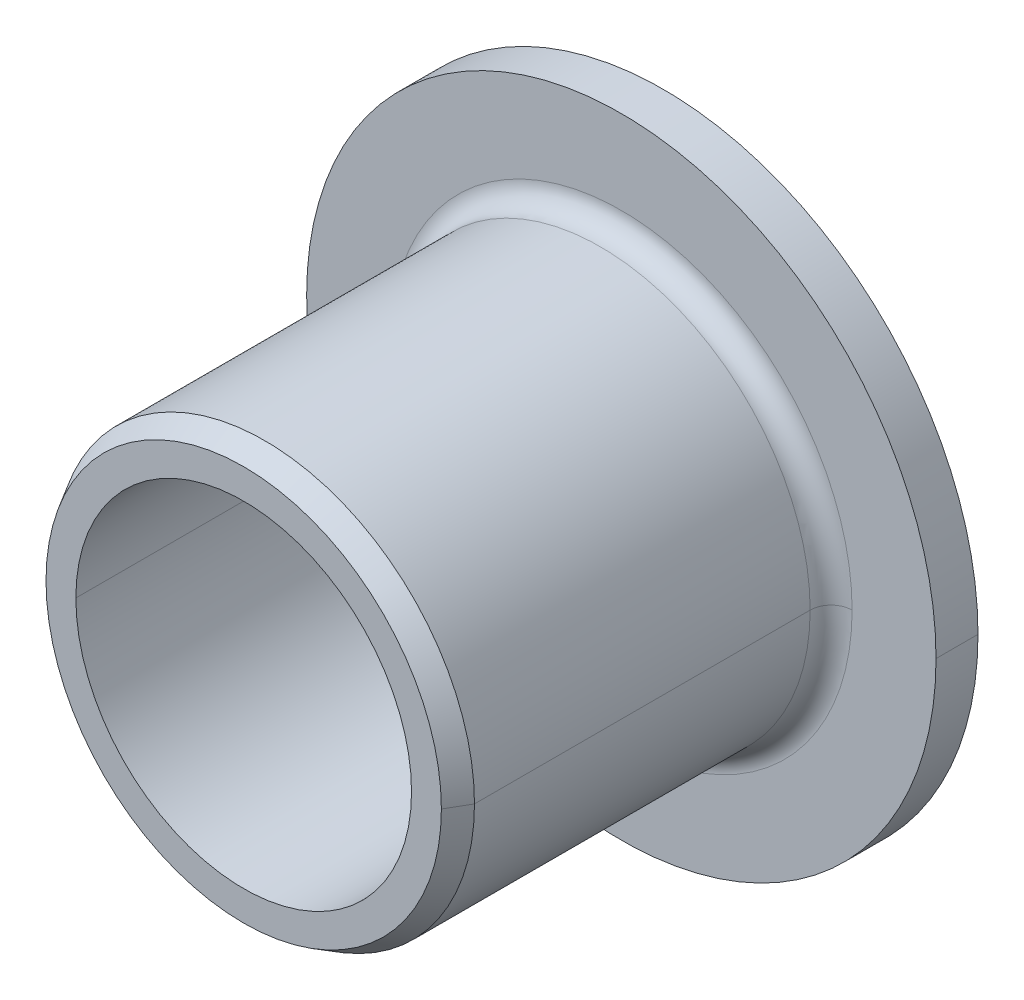
ISO-10303-21;
HEADER;
FILE_DESCRIPTION(('STEP AP214'),'2;1');
FILE_NAME('part.step','',(''),(''),'','','');
FILE_SCHEMA(('AUTOMOTIVE_DESIGN { 1 0 10303 214 1 1 1 1 }'));
ENDSEC;
DATA;
#1=APPLICATION_CONTEXT('core data for automotive mechanical design processes');
#2=APPLICATION_PROTOCOL_DEFINITION('international standard','automotive_design',2000,#1);
#3=PRODUCT_CONTEXT('',#1,'mechanical');
#4=PRODUCT('Part','Part','',(#3));
#5=PRODUCT_RELATED_PRODUCT_CATEGORY('part','',(#4));
#6=PRODUCT_DEFINITION_FORMATION('','',#4);
#7=PRODUCT_DEFINITION_CONTEXT('part definition',#1,'design');
#8=PRODUCT_DEFINITION('design','',#6,#7);
#9=PRODUCT_DEFINITION_SHAPE('','',#8);
#10=(LENGTH_UNIT() NAMED_UNIT(*) SI_UNIT(.MILLI.,.METRE.));
#11=(NAMED_UNIT(*) PLANE_ANGLE_UNIT() SI_UNIT($,.RADIAN.));
#12=(NAMED_UNIT(*) SI_UNIT($,.STERADIAN.) SOLID_ANGLE_UNIT());
#13=UNCERTAINTY_MEASURE_WITH_UNIT(LENGTH_MEASURE(1.E-05),#10,'distance_accuracy_value','');
#14=(GEOMETRIC_REPRESENTATION_CONTEXT(3) GLOBAL_UNCERTAINTY_ASSIGNED_CONTEXT((#13)) GLOBAL_UNIT_ASSIGNED_CONTEXT((#10,
#11,#12)) REPRESENTATION_CONTEXT('',''));
#15=CARTESIAN_POINT('',(0.,0.,0.));
#16=DIRECTION('',(0.,0.,1.));
#17=DIRECTION('',(1.,0.,0.));
#18=AXIS2_PLACEMENT_3D('',#15,#16,#17);
#19=CARTESIAN_POINT('',(5.75,0.,0.));
#20=DIRECTION('',(0.,0.,-1.));
#21=DIRECTION('',(0.,-1.,0.));
#22=AXIS2_PLACEMENT_3D('',#19,#20,#21);
#23=PLANE('',#22);
#24=CARTESIAN_POINT('',(0.,0.,0.));
#25=DIRECTION('',(0.,0.,1.));
#26=DIRECTION('',(1.,0.,0.));
#27=AXIS2_PLACEMENT_3D('',#24,#25,#26);
#28=CIRCLE('',#27,4.);
#29=CARTESIAN_POINT('',(4.,0.,0.));
#30=VERTEX_POINT('',#29);
#31=CARTESIAN_POINT('',(-4.,0.,0.));
#32=VERTEX_POINT('',#31);
#33=EDGE_CURVE('E10',#30,#32,#28,.T.);
#34=ORIENTED_EDGE('',*,*,#33,.T.);
#35=CARTESIAN_POINT('',(0.,0.,0.));
#36=DIRECTION('',(0.,0.,1.));
#37=DIRECTION('',(1.,0.,0.));
#38=AXIS2_PLACEMENT_3D('',#35,#36,#37);
#39=CIRCLE('',#38,4.);
#40=EDGE_CURVE('E115',#32,#30,#39,.T.);
#41=ORIENTED_EDGE('',*,*,#40,.T.);
#42=EDGE_LOOP('',(#34,#41));
#43=FACE_BOUND('',#42,.T.);
#44=CARTESIAN_POINT('',(0.,0.,0.));
#45=DIRECTION('',(0.,0.,1.));
#46=DIRECTION('',(1.,0.,0.));
#47=AXIS2_PLACEMENT_3D('',#44,#45,#46);
#48=CIRCLE('',#47,7.5);
#49=CARTESIAN_POINT('',(7.5,0.,0.));
#50=VERTEX_POINT('',#49);
#51=CARTESIAN_POINT('',(-7.5,0.,0.));
#52=VERTEX_POINT('',#51);
#53=EDGE_CURVE('E190',#50,#52,#48,.T.);
#54=ORIENTED_EDGE('',*,*,#53,.F.);
#55=CARTESIAN_POINT('',(0.,0.,0.));
#56=DIRECTION('',(0.,0.,1.));
#57=DIRECTION('',(1.,0.,0.));
#58=AXIS2_PLACEMENT_3D('',#55,#56,#57);
#59=CIRCLE('',#58,7.5);
#60=EDGE_CURVE('E135',#52,#50,#59,.T.);
#61=ORIENTED_EDGE('',*,*,#60,.F.);
#62=EDGE_LOOP('',(#54,#61));
#63=FACE_BOUND('',#62,.T.);
#64=ADVANCED_FACE('F16',(#43,#63),#23,.T.);
#65=CARTESIAN_POINT('',(0.,0.,5.));
#66=DIRECTION('',(0.,0.,1.));
#67=DIRECTION('',(1.,0.,0.));
#68=AXIS2_PLACEMENT_3D('',#65,#66,#67);
#69=CYLINDRICAL_SURFACE('',#68,4.);
#70=DIRECTION('',(0.,0.,1.));
#71=VECTOR('',#70,1.);
#72=CARTESIAN_POINT('',(4.,0.,5.));
#73=LINE('',#72,#71);
#74=CARTESIAN_POINT('',(4.,0.,10.));
#75=VERTEX_POINT('',#74);
#76=EDGE_CURVE('E110',#30,#75,#73,.T.);
#77=ORIENTED_EDGE('',*,*,#76,.T.);
#78=CARTESIAN_POINT('',(0.,0.,10.));
#79=DIRECTION('',(0.,0.,1.));
#80=DIRECTION('',(1.,0.,0.));
#81=AXIS2_PLACEMENT_3D('',#78,#79,#80);
#82=CIRCLE('',#81,4.);
#83=CARTESIAN_POINT('',(-4.,0.,10.));
#84=VERTEX_POINT('',#83);
#85=EDGE_CURVE('E27',#75,#84,#82,.T.);
#86=ORIENTED_EDGE('',*,*,#85,.T.);
#87=DIRECTION('',(0.,0.,-1.));
#88=VECTOR('',#87,1.);
#89=CARTESIAN_POINT('',(-4.,0.,5.));
#90=LINE('',#89,#88);
#91=EDGE_CURVE('E112',#84,#32,#90,.T.);
#92=ORIENTED_EDGE('',*,*,#91,.T.);
#93=ORIENTED_EDGE('',*,*,#33,.F.);
#94=EDGE_LOOP('',(#77,#86,#92,#93));
#95=FACE_BOUND('',#94,.T.);
#96=ADVANCED_FACE('F108',(#95),#69,.F.);
#97=CARTESIAN_POINT('',(4.3556624327,0.,10.));
#98=DIRECTION('',(0.,0.,1.));
#99=DIRECTION('',(1.,0.,0.));
#100=AXIS2_PLACEMENT_3D('',#97,#98,#99);
#101=PLANE('',#100);
#102=ORIENTED_EDGE('',*,*,#85,.F.);
#103=CARTESIAN_POINT('',(0.,0.,10.));
#104=DIRECTION('',(0.,0.,1.));
#105=DIRECTION('',(1.,0.,0.));
#106=AXIS2_PLACEMENT_3D('',#103,#104,#105);
#107=CIRCLE('',#106,4.);
#108=EDGE_CURVE('E123',#84,#75,#107,.T.);
#109=ORIENTED_EDGE('',*,*,#108,.F.);
#110=EDGE_LOOP('',(#102,#109));
#111=FACE_BOUND('',#110,.T.);
#112=CARTESIAN_POINT('',(0.,0.,10.));
#113=DIRECTION('',(0.,0.,1.));
#114=DIRECTION('',(1.,0.,0.));
#115=AXIS2_PLACEMENT_3D('',#112,#113,#114);
#116=CIRCLE('',#115,4.7113248654);
#117=CARTESIAN_POINT('',(4.7113248654,0.,10.));
#118=VERTEX_POINT('',#117);
#119=CARTESIAN_POINT('',(-4.7113248654,0.,10.));
#120=VERTEX_POINT('',#119);
#121=EDGE_CURVE('E225',#118,#120,#116,.T.);
#122=ORIENTED_EDGE('',*,*,#121,.T.);
#123=CARTESIAN_POINT('',(0.,0.,10.));
#124=DIRECTION('',(0.,0.,1.));
#125=DIRECTION('',(1.,0.,0.));
#126=AXIS2_PLACEMENT_3D('',#123,#124,#125);
#127=CIRCLE('',#126,4.7113248654);
#128=EDGE_CURVE('E152',#120,#118,#127,.T.);
#129=ORIENTED_EDGE('',*,*,#128,.T.);
#130=EDGE_LOOP('',(#122,#129));
#131=FACE_BOUND('',#130,.T.);
#132=ADVANCED_FACE('F306',(#111,#131),#101,.T.);
#133=CARTESIAN_POINT('',(0.,0.,9.75));
#134=DIRECTION('',(0.,0.,-1.));
#135=DIRECTION('',(1.,0.,0.));
#136=AXIS2_PLACEMENT_3D('',#133,#134,#135);
#137=CONICAL_SURFACE('',#136,4.8556624327,0.52359877560608);
#138=DIRECTION('',(-0.500000000006738,0.,0.866025403780548));
#139=VECTOR('',#138,1.);
#140=CARTESIAN_POINT('',(4.8556624327,0.,9.75));
#141=LINE('',#140,#139);
#142=CARTESIAN_POINT('',(5.,0.,9.5));
#143=VERTEX_POINT('',#142);
#144=EDGE_CURVE('E141',#143,#118,#141,.T.);
#145=ORIENTED_EDGE('',*,*,#144,.T.);
#146=ORIENTED_EDGE('',*,*,#128,.F.);
#147=DIRECTION('',(-0.500000000006738,0.,-0.866025403780548));
#148=VECTOR('',#147,1.);
#149=CARTESIAN_POINT('',(-4.8556624327,0.,9.75));
#150=LINE('',#149,#148);
#151=CARTESIAN_POINT('',(-5.,0.,9.5));
#152=VERTEX_POINT('',#151);
#153=EDGE_CURVE('E140',#120,#152,#150,.T.);
#154=ORIENTED_EDGE('',*,*,#153,.T.);
#155=CARTESIAN_POINT('',(0.,0.,9.5));
#156=DIRECTION('',(0.,0.,1.));
#157=DIRECTION('',(1.,0.,0.));
#158=AXIS2_PLACEMENT_3D('',#155,#156,#157);
#159=CIRCLE('',#158,5.);
#160=EDGE_CURVE('E134',#152,#143,#159,.T.);
#161=ORIENTED_EDGE('',*,*,#160,.T.);
#162=EDGE_LOOP('',(#145,#146,#154,#161));
#163=FACE_BOUND('',#162,.T.);
#164=ADVANCED_FACE('F232',(#163),#137,.T.);
#165=CARTESIAN_POINT('',(0.,0.,5.5));
#166=DIRECTION('',(0.,0.,1.));
#167=DIRECTION('',(1.,0.,0.));
#168=AXIS2_PLACEMENT_3D('',#165,#166,#167);
#169=CYLINDRICAL_SURFACE('',#168,5.);
#170=DIRECTION('',(0.,0.,1.));
#171=VECTOR('',#170,1.);
#172=CARTESIAN_POINT('',(5.,0.,5.5));
#173=LINE('',#172,#171);
#174=CARTESIAN_POINT('',(5.,0.,1.5));
#175=VERTEX_POINT('',#174);
#176=EDGE_CURVE('E146',#175,#143,#173,.T.);
#177=ORIENTED_EDGE('',*,*,#176,.T.);
#178=ORIENTED_EDGE('',*,*,#160,.F.);
#179=DIRECTION('',(0.,0.,-1.));
#180=VECTOR('',#179,1.);
#181=CARTESIAN_POINT('',(-5.,0.,5.5));
#182=LINE('',#181,#180);
#183=CARTESIAN_POINT('',(-5.,0.,1.5));
#184=VERTEX_POINT('',#183);
#185=EDGE_CURVE('E145',#152,#184,#182,.T.);
#186=ORIENTED_EDGE('',*,*,#185,.T.);
#187=CARTESIAN_POINT('',(0.,0.,1.5));
#188=DIRECTION('',(0.,0.,1.));
#189=DIRECTION('',(1.,0.,0.));
#190=AXIS2_PLACEMENT_3D('',#187,#188,#189);
#191=CIRCLE('',#190,5.);
#192=EDGE_CURVE('E186',#184,#175,#191,.T.);
#193=ORIENTED_EDGE('',*,*,#192,.T.);
#194=EDGE_LOOP('',(#177,#178,#186,#193));
#195=FACE_BOUND('',#194,.T.);
#196=ADVANCED_FACE('F323',(#195),#169,.T.);
#197=CARTESIAN_POINT('',(0.,0.,1.5));
#198=DIRECTION('',(0.,0.,1.));
#199=DIRECTION('',(1.,0.,0.));
#200=AXIS2_PLACEMENT_3D('',#197,#198,#199);
#201=TOROIDAL_SURFACE('',#200,5.5,0.5);
#202=CARTESIAN_POINT('',(-5.5,0.,1.5));
#203=DIRECTION('',(0.,-1.,0.));
#204=DIRECTION('',(-1.,0.,0.));
#205=AXIS2_PLACEMENT_3D('',#202,#203,#204);
#206=CIRCLE('',#205,0.5);
#207=CARTESIAN_POINT('',(-5.5,0.,1.));
#208=VERTEX_POINT('',#207);
#209=EDGE_CURVE('E148',#208,#184,#206,.T.);
#210=ORIENTED_EDGE('',*,*,#209,.T.);
#211=CARTESIAN_POINT('',(0.,0.,1.5));
#212=DIRECTION('',(0.,0.,1.));
#213=DIRECTION('',(1.,0.,0.));
#214=AXIS2_PLACEMENT_3D('',#211,#212,#213);
#215=CIRCLE('',#214,5.);
#216=EDGE_CURVE('E142',#175,#184,#215,.T.);
#217=ORIENTED_EDGE('',*,*,#216,.F.);
#218=CARTESIAN_POINT('',(5.5,0.,1.5));
#219=DIRECTION('',(0.,-1.,0.));
#220=DIRECTION('',(1.,0.,0.));
#221=AXIS2_PLACEMENT_3D('',#218,#219,#220);
#222=CIRCLE('',#221,0.5);
#223=CARTESIAN_POINT('',(5.5,0.,1.));
#224=VERTEX_POINT('',#223);
#225=EDGE_CURVE('E20',#175,#224,#222,.T.);
#226=ORIENTED_EDGE('',*,*,#225,.T.);
#227=CARTESIAN_POINT('',(0.,0.,1.));
#228=DIRECTION('',(0.,0.,1.));
#229=DIRECTION('',(1.,0.,0.));
#230=AXIS2_PLACEMENT_3D('',#227,#228,#229);
#231=CIRCLE('',#230,5.5);
#232=EDGE_CURVE('E62',#224,#208,#231,.T.);
#233=ORIENTED_EDGE('',*,*,#232,.T.);
#234=EDGE_LOOP('',(#210,#217,#226,#233));
#235=FACE_BOUND('',#234,.T.);
#236=ADVANCED_FACE('F216',(#235),#201,.F.);
#237=CARTESIAN_POINT('',(6.5,0.,1.));
#238=DIRECTION('',(0.,0.,1.));
#239=DIRECTION('',(1.,0.,0.));
#240=AXIS2_PLACEMENT_3D('',#237,#238,#239);
#241=PLANE('',#240);
#242=ORIENTED_EDGE('',*,*,#232,.F.);
#243=CARTESIAN_POINT('',(0.,0.,1.));
#244=DIRECTION('',(0.,0.,1.));
#245=DIRECTION('',(1.,0.,0.));
#246=AXIS2_PLACEMENT_3D('',#243,#244,#245);
#247=CIRCLE('',#246,5.5);
#248=EDGE_CURVE('E150',#208,#224,#247,.T.);
#249=ORIENTED_EDGE('',*,*,#248,.F.);
#250=EDGE_LOOP('',(#242,#249));
#251=FACE_BOUND('',#250,.T.);
#252=CARTESIAN_POINT('',(0.,0.,1.));
#253=DIRECTION('',(0.,0.,1.));
#254=DIRECTION('',(1.,0.,0.));
#255=AXIS2_PLACEMENT_3D('',#252,#253,#254);
#256=CIRCLE('',#255,7.5);
#257=CARTESIAN_POINT('',(7.5,0.,1.));
#258=VERTEX_POINT('',#257);
#259=CARTESIAN_POINT('',(-7.5,0.,1.));
#260=VERTEX_POINT('',#259);
#261=EDGE_CURVE('E175',#258,#260,#256,.T.);
#262=ORIENTED_EDGE('',*,*,#261,.T.);
#263=CARTESIAN_POINT('',(0.,0.,1.));
#264=DIRECTION('',(0.,0.,1.));
#265=DIRECTION('',(1.,0.,0.));
#266=AXIS2_PLACEMENT_3D('',#263,#264,#265);
#267=CIRCLE('',#266,7.5);
#268=EDGE_CURVE('E41',#260,#258,#267,.T.);
#269=ORIENTED_EDGE('',*,*,#268,.T.);
#270=EDGE_LOOP('',(#262,#269));
#271=FACE_BOUND('',#270,.T.);
#272=ADVANCED_FACE('F18',(#251,#271),#241,.T.);
#273=CARTESIAN_POINT('',(0.,0.,0.5));
#274=DIRECTION('',(0.,0.,1.));
#275=DIRECTION('',(1.,0.,0.));
#276=AXIS2_PLACEMENT_3D('',#273,#274,#275);
#277=CYLINDRICAL_SURFACE('',#276,7.5);
#278=DIRECTION('',(0.,0.,1.));
#279=VECTOR('',#278,1.);
#280=CARTESIAN_POINT('',(7.5,0.,0.5));
#281=LINE('',#280,#279);
#282=EDGE_CURVE('E188',#50,#258,#281,.T.);
#283=ORIENTED_EDGE('',*,*,#282,.T.);
#284=ORIENTED_EDGE('',*,*,#268,.F.);
#285=DIRECTION('',(0.,0.,-1.));
#286=VECTOR('',#285,1.);
#287=CARTESIAN_POINT('',(-7.5,0.,0.5));
#288=LINE('',#287,#286);
#289=EDGE_CURVE('E182',#260,#52,#288,.T.);
#290=ORIENTED_EDGE('',*,*,#289,.T.);
#291=ORIENTED_EDGE('',*,*,#60,.T.);
#292=EDGE_LOOP('',(#283,#284,#290,#291));
#293=FACE_BOUND('',#292,.T.);
#294=ADVANCED_FACE('F215',(#293),#277,.T.);
#295=CARTESIAN_POINT('',(0.,0.,0.5));
#296=DIRECTION('',(0.,0.,1.));
#297=DIRECTION('',(1.,0.,0.));
#298=AXIS2_PLACEMENT_3D('',#295,#296,#297);
#299=CYLINDRICAL_SURFACE('',#298,7.5);
#300=ORIENTED_EDGE('',*,*,#282,.F.);
#301=ORIENTED_EDGE('',*,*,#53,.T.);
#302=ORIENTED_EDGE('',*,*,#289,.F.);
#303=ORIENTED_EDGE('',*,*,#261,.F.);
#304=EDGE_LOOP('',(#300,#301,#302,#303));
#305=FACE_BOUND('',#304,.T.);
#306=ADVANCED_FACE('F219',(#305),#299,.T.);
#307=CARTESIAN_POINT('',(0.,0.,1.5));
#308=DIRECTION('',(0.,0.,1.));
#309=DIRECTION('',(1.,0.,0.));
#310=AXIS2_PLACEMENT_3D('',#307,#308,#309);
#311=TOROIDAL_SURFACE('',#310,5.5,0.5);
#312=ORIENTED_EDGE('',*,*,#209,.F.);
#313=ORIENTED_EDGE('',*,*,#248,.T.);
#314=ORIENTED_EDGE('',*,*,#225,.F.);
#315=ORIENTED_EDGE('',*,*,#192,.F.);
#316=EDGE_LOOP('',(#312,#313,#314,#315));
#317=FACE_BOUND('',#316,.T.);
#318=ADVANCED_FACE('F213',(#317),#311,.F.);
#319=CARTESIAN_POINT('',(0.,0.,5.5));
#320=DIRECTION('',(0.,0.,1.));
#321=DIRECTION('',(1.,0.,0.));
#322=AXIS2_PLACEMENT_3D('',#319,#320,#321);
#323=CYLINDRICAL_SURFACE('',#322,5.);
#324=ORIENTED_EDGE('',*,*,#176,.F.);
#325=ORIENTED_EDGE('',*,*,#216,.T.);
#326=ORIENTED_EDGE('',*,*,#185,.F.);
#327=CARTESIAN_POINT('',(0.,0.,9.5));
#328=DIRECTION('',(0.,0.,1.));
#329=DIRECTION('',(1.,0.,0.));
#330=AXIS2_PLACEMENT_3D('',#327,#328,#329);
#331=CIRCLE('',#330,5.);
#332=EDGE_CURVE('E136',#143,#152,#331,.T.);
#333=ORIENTED_EDGE('',*,*,#332,.F.);
#334=EDGE_LOOP('',(#324,#325,#326,#333));
#335=FACE_BOUND('',#334,.T.);
#336=ADVANCED_FACE('F240',(#335),#323,.T.);
#337=CARTESIAN_POINT('',(0.,0.,9.75));
#338=DIRECTION('',(0.,0.,-1.));
#339=DIRECTION('',(1.,0.,0.));
#340=AXIS2_PLACEMENT_3D('',#337,#338,#339);
#341=CONICAL_SURFACE('',#340,4.8556624327,0.52359877560608);
#342=ORIENTED_EDGE('',*,*,#144,.F.);
#343=ORIENTED_EDGE('',*,*,#332,.T.);
#344=ORIENTED_EDGE('',*,*,#153,.F.);
#345=ORIENTED_EDGE('',*,*,#121,.F.);
#346=EDGE_LOOP('',(#342,#343,#344,#345));
#347=FACE_BOUND('',#346,.T.);
#348=ADVANCED_FACE('F236',(#347),#341,.T.);
#349=CARTESIAN_POINT('',(0.,0.,5.));
#350=DIRECTION('',(0.,0.,1.));
#351=DIRECTION('',(1.,0.,0.));
#352=AXIS2_PLACEMENT_3D('',#349,#350,#351);
#353=CYLINDRICAL_SURFACE('',#352,4.);
#354=ORIENTED_EDGE('',*,*,#76,.F.);
#355=ORIENTED_EDGE('',*,*,#40,.F.);
#356=ORIENTED_EDGE('',*,*,#91,.F.);
#357=ORIENTED_EDGE('',*,*,#108,.T.);
#358=EDGE_LOOP('',(#354,#355,#356,#357));
#359=FACE_BOUND('',#358,.T.);
#360=ADVANCED_FACE('F121',(#359),#353,.F.);
#361=CLOSED_SHELL('',(#64,#96,#132,#164,#196,#236,#272,#294,#306,#318,#336,#348,#360));
#362=MANIFOLD_SOLID_BREP('B1',#361);
#363=ADVANCED_BREP_SHAPE_REPRESENTATION('',(#18,#362),#14);
#364=SHAPE_DEFINITION_REPRESENTATION(#9,#363);
ENDSEC;
END-ISO-10303-21;
